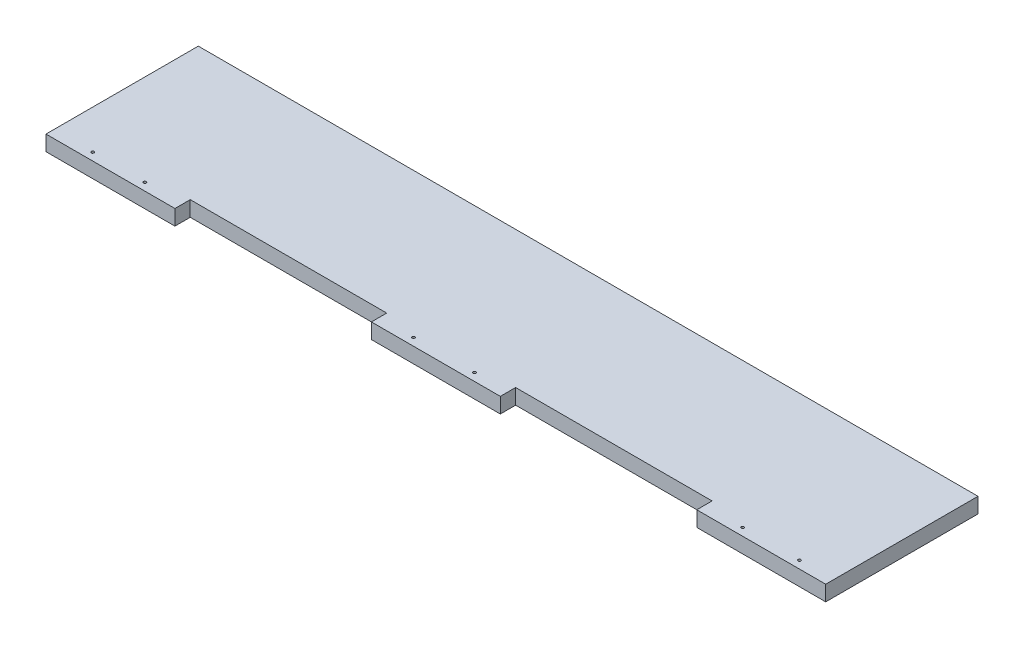
ISO-10303-21;
HEADER;
FILE_DESCRIPTION(('STEP AP214'),'2;1');
FILE_NAME('part.step','',(''),(''),'','','');
FILE_SCHEMA(('AUTOMOTIVE_DESIGN { 1 0 10303 214 1 1 1 1 }'));
ENDSEC;
DATA;
#1=APPLICATION_CONTEXT('core data for automotive mechanical design processes');
#2=APPLICATION_PROTOCOL_DEFINITION('international standard','automotive_design',2000,#1);
#3=PRODUCT_CONTEXT('',#1,'mechanical');
#4=PRODUCT('Part','Part','',(#3));
#5=PRODUCT_RELATED_PRODUCT_CATEGORY('part','',(#4));
#6=PRODUCT_DEFINITION_FORMATION('','',#4);
#7=PRODUCT_DEFINITION_CONTEXT('part definition',#1,'design');
#8=PRODUCT_DEFINITION('design','',#6,#7);
#9=PRODUCT_DEFINITION_SHAPE('','',#8);
#10=(LENGTH_UNIT() NAMED_UNIT(*) SI_UNIT(.MILLI.,.METRE.));
#11=(NAMED_UNIT(*) PLANE_ANGLE_UNIT() SI_UNIT($,.RADIAN.));
#12=(NAMED_UNIT(*) SI_UNIT($,.STERADIAN.) SOLID_ANGLE_UNIT());
#13=UNCERTAINTY_MEASURE_WITH_UNIT(LENGTH_MEASURE(1.E-05),#10,'distance_accuracy_value','');
#14=(GEOMETRIC_REPRESENTATION_CONTEXT(3) GLOBAL_UNCERTAINTY_ASSIGNED_CONTEXT((#13)) GLOBAL_UNIT_ASSIGNED_CONTEXT((#10,
#11,#12)) REPRESENTATION_CONTEXT('',''));
#15=CARTESIAN_POINT('',(0.,0.,0.));
#16=DIRECTION('',(0.,0.,1.));
#17=DIRECTION('',(1.,0.,0.));
#18=AXIS2_PLACEMENT_3D('',#15,#16,#17);
#19=CARTESIAN_POINT('',(-929.418408841076,3217.29154429096,189.));
#20=DIRECTION('',(0.,-1.,0.));
#21=DIRECTION('',(0.,0.,-1.));
#22=AXIS2_PLACEMENT_3D('',#19,#20,#21);
#23=PLANE('',#22);
#24=CARTESIAN_POINT('',(-971.446220261641,3217.29154429096,198.5));
#25=DIRECTION('',(0.,1.,0.));
#26=DIRECTION('',(0.,0.,1.));
#27=AXIS2_PLACEMENT_3D('',#24,#25,#26);
#28=CIRCLE('',#27,1.70000000000003);
#29=CARTESIAN_POINT('',(-971.446220261641,3217.29154429096,200.2));
#30=VERTEX_POINT('',#29);
#31=EDGE_CURVE('E286',#30,#30,#28,.T.);
#32=ORIENTED_EDGE('',*,*,#31,.F.);
#33=EDGE_LOOP('',(#32));
#34=FACE_BOUND('',#33,.T.);
#35=CARTESIAN_POINT('',(-1041.97724555431,3217.29154429096,198.5));
#36=DIRECTION('',(0.,1.,0.));
#37=DIRECTION('',(0.,0.,1.));
#38=AXIS2_PLACEMENT_3D('',#35,#36,#37);
#39=CIRCLE('',#38,1.70000000000003);
#40=CARTESIAN_POINT('',(-1041.97724555431,3217.29154429096,200.2));
#41=VERTEX_POINT('',#40);
#42=EDGE_CURVE('E280',#41,#41,#39,.T.);
#43=ORIENTED_EDGE('',*,*,#42,.F.);
#44=EDGE_LOOP('',(#43));
#45=FACE_BOUND('',#44,.T.);
#46=CARTESIAN_POINT('',(-1374.86191229691,3217.29154429096,198.5));
#47=DIRECTION('',(0.,1.,0.));
#48=DIRECTION('',(0.,0.,1.));
#49=AXIS2_PLACEMENT_3D('',#46,#47,#48);
#50=CIRCLE('',#49,1.70000000000003);
#51=CARTESIAN_POINT('',(-1374.86191229691,3217.29154429096,200.2));
#52=VERTEX_POINT('',#51);
#53=EDGE_CURVE('E274',#52,#52,#50,.T.);
#54=ORIENTED_EDGE('',*,*,#53,.F.);
#55=EDGE_LOOP('',(#54));
#56=FACE_BOUND('',#55,.T.);
#57=CARTESIAN_POINT('',(-1450.47578184059,3217.29154429096,198.5));
#58=DIRECTION('',(0.,1.,0.));
#59=DIRECTION('',(0.,0.,1.));
#60=AXIS2_PLACEMENT_3D('',#57,#58,#59);
#61=CIRCLE('',#60,1.70000000000003);
#62=CARTESIAN_POINT('',(-1450.47578184059,3217.29154429096,200.2));
#63=VERTEX_POINT('',#62);
#64=EDGE_CURVE('E268',#63,#63,#61,.T.);
#65=ORIENTED_EDGE('',*,*,#64,.F.);
#66=EDGE_LOOP('',(#65));
#67=FACE_BOUND('',#66,.T.);
#68=CARTESIAN_POINT('',(-1783.80265985826,3217.29154429096,198.5));
#69=DIRECTION('',(0.,1.,0.));
#70=DIRECTION('',(0.,0.,1.));
#71=AXIS2_PLACEMENT_3D('',#68,#69,#70);
#72=CIRCLE('',#71,1.70000000000003);
#73=CARTESIAN_POINT('',(-1783.80265985826,3217.29154429096,200.2));
#74=VERTEX_POINT('',#73);
#75=EDGE_CURVE('E262',#74,#74,#72,.T.);
#76=ORIENTED_EDGE('',*,*,#75,.F.);
#77=EDGE_LOOP('',(#76));
#78=FACE_BOUND('',#77,.T.);
#79=DIRECTION('',(-1.,0.,0.));
#80=VECTOR('',#79,1.);
#81=CARTESIAN_POINT('',(-929.418408841076,3217.29154429096,19.));
#82=LINE('',#81,#80);
#83=CARTESIAN_POINT('',(-929.418408841076,3217.29154429096,19.));
#84=VERTEX_POINT('',#83);
#85=CARTESIAN_POINT('',(-1897.01840884108,3217.29154429096,19.));
#86=VERTEX_POINT('',#85);
#87=EDGE_CURVE('E230',#84,#86,#82,.T.);
#88=ORIENTED_EDGE('',*,*,#87,.T.);
#89=DIRECTION('',(0.,0.,-1.));
#90=VECTOR('',#89,1.);
#91=CARTESIAN_POINT('',(-1897.01840884108,3217.29154429096,189.));
#92=LINE('',#91,#90);
#93=CARTESIAN_POINT('',(-1897.01840884108,3217.29154429096,208.));
#94=VERTEX_POINT('',#93);
#95=EDGE_CURVE('E41',#94,#86,#92,.T.);
#96=ORIENTED_EDGE('',*,*,#95,.F.);
#97=DIRECTION('',(1.,0.,0.));
#98=VECTOR('',#97,1.);
#99=CARTESIAN_POINT('',(-1737.01840884108,3217.29154429096,208.));
#100=LINE('',#99,#98);
#101=CARTESIAN_POINT('',(-1737.01840884108,3217.29154429096,208.));
#102=VERTEX_POINT('',#101);
#103=EDGE_CURVE('E203',#94,#102,#100,.T.);
#104=ORIENTED_EDGE('',*,*,#103,.T.);
#105=DIRECTION('',(0.,0.,-1.));
#106=VECTOR('',#105,1.);
#107=CARTESIAN_POINT('',(-1737.01840884108,3217.29154429096,227.));
#108=LINE('',#107,#106);
#109=CARTESIAN_POINT('',(-1737.01840884108,3217.29154429096,189.));
#110=VERTEX_POINT('',#109);
#111=EDGE_CURVE('E214',#102,#110,#108,.T.);
#112=ORIENTED_EDGE('',*,*,#111,.T.);
#113=DIRECTION('',(-1.,0.,0.));
#114=VECTOR('',#113,1.);
#115=CARTESIAN_POINT('',(-929.418408841076,3217.29154429096,189.));
#116=LINE('',#115,#114);
#117=CARTESIAN_POINT('',(-1493.21840884108,3217.29154429096,189.));
#118=VERTEX_POINT('',#117);
#119=EDGE_CURVE('E225',#118,#110,#116,.T.);
#120=ORIENTED_EDGE('',*,*,#119,.F.);
#121=DIRECTION('',(0.,0.,-1.));
#122=VECTOR('',#121,1.);
#123=CARTESIAN_POINT('',(-1493.21840884108,3217.29154429096,227.));
#124=LINE('',#123,#122);
#125=CARTESIAN_POINT('',(-1493.21840884108,3217.29154429096,208.));
#126=VERTEX_POINT('',#125);
#127=EDGE_CURVE('E183',#126,#118,#124,.T.);
#128=ORIENTED_EDGE('',*,*,#127,.F.);
#129=DIRECTION('',(1.,0.,0.));
#130=VECTOR('',#129,1.);
#131=CARTESIAN_POINT('',(-1333.21840884108,3217.29154429096,208.));
#132=LINE('',#131,#130);
#133=CARTESIAN_POINT('',(-1333.21840884108,3217.29154429096,208.));
#134=VERTEX_POINT('',#133);
#135=EDGE_CURVE('E167',#126,#134,#132,.T.);
#136=ORIENTED_EDGE('',*,*,#135,.T.);
#137=DIRECTION('',(0.,0.,-1.));
#138=VECTOR('',#137,1.);
#139=CARTESIAN_POINT('',(-1333.21840884108,3217.29154429096,227.));
#140=LINE('',#139,#138);
#141=CARTESIAN_POINT('',(-1333.21840884108,3217.29154429096,189.));
#142=VERTEX_POINT('',#141);
#143=EDGE_CURVE('E189',#134,#142,#140,.T.);
#144=ORIENTED_EDGE('',*,*,#143,.T.);
#145=CARTESIAN_POINT('',(-1089.41840884108,3217.29154429096,189.));
#146=VERTEX_POINT('',#145);
#147=EDGE_CURVE('E129',#146,#142,#116,.T.);
#148=ORIENTED_EDGE('',*,*,#147,.F.);
#149=DIRECTION('',(0.,0.,-1.));
#150=VECTOR('',#149,1.);
#151=CARTESIAN_POINT('',(-1089.41840884108,3217.29154429096,227.));
#152=LINE('',#151,#150);
#153=CARTESIAN_POINT('',(-1089.41840884108,3217.29154429096,208.));
#154=VERTEX_POINT('',#153);
#155=EDGE_CURVE('E140',#154,#146,#152,.T.);
#156=ORIENTED_EDGE('',*,*,#155,.F.);
#157=DIRECTION('',(1.,0.,0.));
#158=VECTOR('',#157,1.);
#159=CARTESIAN_POINT('',(-929.418408841076,3217.29154429096,208.));
#160=LINE('',#159,#158);
#161=CARTESIAN_POINT('',(-929.418408841076,3217.29154429096,208.));
#162=VERTEX_POINT('',#161);
#163=EDGE_CURVE('E139',#154,#162,#160,.T.);
#164=ORIENTED_EDGE('',*,*,#163,.T.);
#165=DIRECTION('',(0.,0.,-1.));
#166=VECTOR('',#165,1.);
#167=CARTESIAN_POINT('',(-929.418408841076,3217.29154429096,189.));
#168=LINE('',#167,#166);
#169=EDGE_CURVE('E11',#162,#84,#168,.T.);
#170=ORIENTED_EDGE('',*,*,#169,.T.);
#171=EDGE_LOOP('',(#88,#96,#104,#112,#120,#128,#136,#144,#148,#156,#164,#170));
#172=FACE_BOUND('',#171,.T.);
#173=CARTESIAN_POINT('',(-1848.5457505431,3217.29154429096,198.5));
#174=DIRECTION('',(0.,1.,0.));
#175=DIRECTION('',(0.,0.,1.));
#176=AXIS2_PLACEMENT_3D('',#173,#174,#175);
#177=CIRCLE('',#176,1.70000000000003);
#178=CARTESIAN_POINT('',(-1848.5457505431,3217.29154429096,200.2));
#179=VERTEX_POINT('',#178);
#180=EDGE_CURVE('E149',#179,#179,#177,.T.);
#181=ORIENTED_EDGE('',*,*,#180,.F.);
#182=EDGE_LOOP('',(#181));
#183=FACE_BOUND('',#182,.T.);
#184=ADVANCED_FACE('F33',(#34,#45,#56,#67,#78,#172,#183),#23,.F.);
#185=CARTESIAN_POINT('',(0.,0.,189.));
#186=DIRECTION('',(0.,0.,-1.));
#187=DIRECTION('',(-1.,0.,0.));
#188=AXIS2_PLACEMENT_3D('',#185,#186,#187);
#189=PLANE('',#188);
#190=CARTESIAN_POINT('',(-1089.41840884108,3217.29154429096,189.));
#191=CARTESIAN_POINT('',(-1089.41840884108,3198.29154429096,189.));
#192=B_SPLINE_CURVE_WITH_KNOTS('',1,(#190,#191),.UNSPECIFIED.,.F.,.F.,(2,2),(0.,
0.0530726256983244),.UNSPECIFIED.);
#193=CARTESIAN_POINT('',(-1089.41840884108,3198.29154429096,189.));
#194=VERTEX_POINT('',#193);
#195=EDGE_CURVE('E48',#146,#194,#192,.T.);
#196=ORIENTED_EDGE('',*,*,#195,.F.);
#197=ORIENTED_EDGE('',*,*,#147,.T.);
#198=CARTESIAN_POINT('',(-1333.21840884108,3198.29154429096,189.));
#199=CARTESIAN_POINT('',(-1333.21840884108,3217.29154429096,189.));
#200=B_SPLINE_CURVE_WITH_KNOTS('',1,(#198,#199),.UNSPECIFIED.,.F.,.F.,(2,2),(0.5,
0.553072625698324),.UNSPECIFIED.);
#201=CARTESIAN_POINT('',(-1333.21840884108,3198.29154429096,189.));
#202=VERTEX_POINT('',#201);
#203=EDGE_CURVE('E124',#202,#142,#200,.T.);
#204=ORIENTED_EDGE('',*,*,#203,.F.);
#205=DIRECTION('',(1.,0.,0.));
#206=VECTOR('',#205,1.);
#207=CARTESIAN_POINT('',(-929.418408841076,3198.29154429096,189.));
#208=LINE('',#207,#206);
#209=EDGE_CURVE('E120',#202,#194,#208,.T.);
#210=ORIENTED_EDGE('',*,*,#209,.T.);
#211=EDGE_LOOP('',(#196,#197,#204,#210));
#212=FACE_BOUND('',#211,.T.);
#213=ADVANCED_FACE('F122',(#212),#189,.F.);
#214=CARTESIAN_POINT('',(-1493.21840884108,3217.29154429096,189.));
#215=CARTESIAN_POINT('',(-1493.21840884108,3198.29154429096,189.));
#216=B_SPLINE_CURVE_WITH_KNOTS('',1,(#214,#215),.UNSPECIFIED.,.F.,.F.,(2,2),(0.,
0.0530726256983244),.UNSPECIFIED.);
#217=CARTESIAN_POINT('',(-1493.21840884108,3198.29154429096,189.));
#218=VERTEX_POINT('',#217);
#219=EDGE_CURVE('E56',#118,#218,#216,.T.);
#220=ORIENTED_EDGE('',*,*,#219,.F.);
#221=ORIENTED_EDGE('',*,*,#119,.T.);
#222=CARTESIAN_POINT('',(-1737.01840884108,3198.29154429096,189.));
#223=CARTESIAN_POINT('',(-1737.01840884108,3217.29154429096,189.));
#224=B_SPLINE_CURVE_WITH_KNOTS('',1,(#222,#223),.UNSPECIFIED.,.F.,.F.,(2,2),(0.5,
0.553072625698324),.UNSPECIFIED.);
#225=CARTESIAN_POINT('',(-1737.01840884108,3198.29154429096,189.));
#226=VERTEX_POINT('',#225);
#227=EDGE_CURVE('E173',#226,#110,#224,.T.);
#228=ORIENTED_EDGE('',*,*,#227,.F.);
#229=EDGE_CURVE('E128',#226,#218,#208,.T.);
#230=ORIENTED_EDGE('',*,*,#229,.T.);
#231=EDGE_LOOP('',(#220,#221,#228,#230));
#232=FACE_BOUND('',#231,.T.);
#233=ADVANCED_FACE('F343',(#232),#189,.F.);
#234=CARTESIAN_POINT('',(-929.418408841076,3217.29154429096,189.));
#235=DIRECTION('',(-1.,0.,0.));
#236=DIRECTION('',(0.,0.,1.));
#237=AXIS2_PLACEMENT_3D('',#234,#235,#236);
#238=PLANE('',#237);
#239=DIRECTION('',(0.,1.,0.));
#240=VECTOR('',#239,1.);
#241=CARTESIAN_POINT('',(-929.418408841076,3217.29154429096,19.));
#242=LINE('',#241,#240);
#243=CARTESIAN_POINT('',(-929.418408841076,3198.29154429096,19.));
#244=VERTEX_POINT('',#243);
#245=EDGE_CURVE('E209',#244,#84,#242,.T.);
#246=ORIENTED_EDGE('',*,*,#245,.T.);
#247=ORIENTED_EDGE('',*,*,#169,.F.);
#248=DIRECTION('',(0.,-1.,0.));
#249=VECTOR('',#248,1.);
#250=CARTESIAN_POINT('',(-929.418408841076,3198.29154429096,208.));
#251=LINE('',#250,#249);
#252=CARTESIAN_POINT('',(-929.418408841076,3198.29154429096,208.));
#253=VERTEX_POINT('',#252);
#254=EDGE_CURVE('E162',#162,#253,#251,.T.);
#255=ORIENTED_EDGE('',*,*,#254,.T.);
#256=DIRECTION('',(0.,0.,-1.));
#257=VECTOR('',#256,1.);
#258=CARTESIAN_POINT('',(-929.418408841076,3198.29154429096,189.));
#259=LINE('',#258,#257);
#260=EDGE_CURVE('E227',#253,#244,#259,.T.);
#261=ORIENTED_EDGE('',*,*,#260,.T.);
#262=EDGE_LOOP('',(#246,#247,#255,#261));
#263=FACE_BOUND('',#262,.T.);
#264=ADVANCED_FACE('F35',(#263),#238,.F.);
#265=CARTESIAN_POINT('',(-1897.01840884108,3217.29154429096,189.));
#266=DIRECTION('',(1.,0.,0.));
#267=DIRECTION('',(0.,0.,-1.));
#268=AXIS2_PLACEMENT_3D('',#265,#266,#267);
#269=PLANE('',#268);
#270=DIRECTION('',(0.,-1.,0.));
#271=VECTOR('',#270,1.);
#272=CARTESIAN_POINT('',(-1897.01840884108,3217.29154429096,19.));
#273=LINE('',#272,#271);
#274=CARTESIAN_POINT('',(-1897.01840884108,3198.29154429096,19.));
#275=VERTEX_POINT('',#274);
#276=EDGE_CURVE('E232',#86,#275,#273,.T.);
#277=ORIENTED_EDGE('',*,*,#276,.T.);
#278=DIRECTION('',(0.,0.,-1.));
#279=VECTOR('',#278,1.);
#280=CARTESIAN_POINT('',(-1897.01840884108,3198.29154429096,189.));
#281=LINE('',#280,#279);
#282=CARTESIAN_POINT('',(-1897.01840884108,3198.29154429096,208.));
#283=VERTEX_POINT('',#282);
#284=EDGE_CURVE('E238',#283,#275,#281,.T.);
#285=ORIENTED_EDGE('',*,*,#284,.F.);
#286=DIRECTION('',(0.,1.,0.));
#287=VECTOR('',#286,1.);
#288=CARTESIAN_POINT('',(-1897.01840884108,3217.29154429096,208.));
#289=LINE('',#288,#287);
#290=EDGE_CURVE('E206',#283,#94,#289,.T.);
#291=ORIENTED_EDGE('',*,*,#290,.T.);
#292=ORIENTED_EDGE('',*,*,#95,.T.);
#293=EDGE_LOOP('',(#277,#285,#291,#292));
#294=FACE_BOUND('',#293,.T.);
#295=ADVANCED_FACE('F243',(#294),#269,.F.);
#296=CARTESIAN_POINT('',(-929.418408841076,3198.29154429096,189.));
#297=DIRECTION('',(0.,1.,0.));
#298=DIRECTION('',(0.,0.,1.));
#299=AXIS2_PLACEMENT_3D('',#296,#297,#298);
#300=PLANE('',#299);
#301=CARTESIAN_POINT('',(-971.446220261641,3198.29154429096,198.5));
#302=DIRECTION('',(0.,1.,0.));
#303=DIRECTION('',(0.,0.,1.));
#304=AXIS2_PLACEMENT_3D('',#301,#302,#303);
#305=CIRCLE('',#304,1.70000000000003);
#306=CARTESIAN_POINT('',(-971.446220261641,3198.29154429096,200.2));
#307=VERTEX_POINT('',#306);
#308=EDGE_CURVE('E283',#307,#307,#305,.T.);
#309=ORIENTED_EDGE('',*,*,#308,.T.);
#310=EDGE_LOOP('',(#309));
#311=FACE_BOUND('',#310,.T.);
#312=CARTESIAN_POINT('',(-1041.97724555431,3198.29154429096,198.5));
#313=DIRECTION('',(0.,1.,0.));
#314=DIRECTION('',(0.,0.,1.));
#315=AXIS2_PLACEMENT_3D('',#312,#313,#314);
#316=CIRCLE('',#315,1.70000000000003);
#317=CARTESIAN_POINT('',(-1041.97724555431,3198.29154429096,200.2));
#318=VERTEX_POINT('',#317);
#319=EDGE_CURVE('E277',#318,#318,#316,.T.);
#320=ORIENTED_EDGE('',*,*,#319,.T.);
#321=EDGE_LOOP('',(#320));
#322=FACE_BOUND('',#321,.T.);
#323=CARTESIAN_POINT('',(-1374.86191229691,3198.29154429096,198.5));
#324=DIRECTION('',(0.,1.,0.));
#325=DIRECTION('',(0.,0.,1.));
#326=AXIS2_PLACEMENT_3D('',#323,#324,#325);
#327=CIRCLE('',#326,1.70000000000003);
#328=CARTESIAN_POINT('',(-1374.86191229691,3198.29154429096,200.2));
#329=VERTEX_POINT('',#328);
#330=EDGE_CURVE('E271',#329,#329,#327,.T.);
#331=ORIENTED_EDGE('',*,*,#330,.T.);
#332=EDGE_LOOP('',(#331));
#333=FACE_BOUND('',#332,.T.);
#334=CARTESIAN_POINT('',(-1450.47578184059,3198.29154429096,198.5));
#335=DIRECTION('',(0.,1.,0.));
#336=DIRECTION('',(0.,0.,1.));
#337=AXIS2_PLACEMENT_3D('',#334,#335,#336);
#338=CIRCLE('',#337,1.70000000000003);
#339=CARTESIAN_POINT('',(-1450.47578184059,3198.29154429096,200.2));
#340=VERTEX_POINT('',#339);
#341=EDGE_CURVE('E265',#340,#340,#338,.T.);
#342=ORIENTED_EDGE('',*,*,#341,.T.);
#343=EDGE_LOOP('',(#342));
#344=FACE_BOUND('',#343,.T.);
#345=CARTESIAN_POINT('',(-1783.80265985826,3198.29154429096,198.5));
#346=DIRECTION('',(0.,1.,0.));
#347=DIRECTION('',(0.,0.,1.));
#348=AXIS2_PLACEMENT_3D('',#345,#346,#347);
#349=CIRCLE('',#348,1.70000000000003);
#350=CARTESIAN_POINT('',(-1783.80265985826,3198.29154429096,200.2));
#351=VERTEX_POINT('',#350);
#352=EDGE_CURVE('E259',#351,#351,#349,.T.);
#353=ORIENTED_EDGE('',*,*,#352,.T.);
#354=EDGE_LOOP('',(#353));
#355=FACE_BOUND('',#354,.T.);
#356=CARTESIAN_POINT('',(-1848.5457505431,3198.29154429096,198.5));
#357=DIRECTION('',(0.,1.,0.));
#358=DIRECTION('',(0.,0.,1.));
#359=AXIS2_PLACEMENT_3D('',#356,#357,#358);
#360=CIRCLE('',#359,1.70000000000003);
#361=CARTESIAN_POINT('',(-1848.5457505431,3198.29154429096,200.2));
#362=VERTEX_POINT('',#361);
#363=EDGE_CURVE('E145',#362,#362,#360,.T.);
#364=ORIENTED_EDGE('',*,*,#363,.T.);
#365=EDGE_LOOP('',(#364));
#366=FACE_BOUND('',#365,.T.);
#367=DIRECTION('',(1.,0.,0.));
#368=VECTOR('',#367,1.);
#369=CARTESIAN_POINT('',(-929.418408841076,3198.29154429096,19.));
#370=LINE('',#369,#368);
#371=EDGE_CURVE('E234',#275,#244,#370,.T.);
#372=ORIENTED_EDGE('',*,*,#371,.T.);
#373=ORIENTED_EDGE('',*,*,#260,.F.);
#374=DIRECTION('',(-1.,0.,0.));
#375=VECTOR('',#374,1.);
#376=CARTESIAN_POINT('',(-1089.41840884108,3198.29154429096,208.));
#377=LINE('',#376,#375);
#378=CARTESIAN_POINT('',(-1089.41840884108,3198.29154429096,208.));
#379=VERTEX_POINT('',#378);
#380=EDGE_CURVE('E136',#253,#379,#377,.T.);
#381=ORIENTED_EDGE('',*,*,#380,.T.);
#382=DIRECTION('',(0.,0.,-1.));
#383=VECTOR('',#382,1.);
#384=CARTESIAN_POINT('',(-1089.41840884108,3198.29154429096,227.));
#385=LINE('',#384,#383);
#386=EDGE_CURVE('E133',#379,#194,#385,.T.);
#387=ORIENTED_EDGE('',*,*,#386,.T.);
#388=ORIENTED_EDGE('',*,*,#209,.F.);
#389=DIRECTION('',(0.,0.,-1.));
#390=VECTOR('',#389,1.);
#391=CARTESIAN_POINT('',(-1333.21840884108,3198.29154429096,227.));
#392=LINE('',#391,#390);
#393=CARTESIAN_POINT('',(-1333.21840884108,3198.29154429096,208.));
#394=VERTEX_POINT('',#393);
#395=EDGE_CURVE('E192',#394,#202,#392,.T.);
#396=ORIENTED_EDGE('',*,*,#395,.F.);
#397=DIRECTION('',(-1.,0.,0.));
#398=VECTOR('',#397,1.);
#399=CARTESIAN_POINT('',(-1493.21840884108,3198.29154429096,208.));
#400=LINE('',#399,#398);
#401=CARTESIAN_POINT('',(-1493.21840884108,3198.29154429096,208.));
#402=VERTEX_POINT('',#401);
#403=EDGE_CURVE('E166',#394,#402,#400,.T.);
#404=ORIENTED_EDGE('',*,*,#403,.T.);
#405=DIRECTION('',(0.,0.,-1.));
#406=VECTOR('',#405,1.);
#407=CARTESIAN_POINT('',(-1493.21840884108,3198.29154429096,227.));
#408=LINE('',#407,#406);
#409=EDGE_CURVE('E194',#402,#218,#408,.T.);
#410=ORIENTED_EDGE('',*,*,#409,.T.);
#411=ORIENTED_EDGE('',*,*,#229,.F.);
#412=DIRECTION('',(0.,0.,-1.));
#413=VECTOR('',#412,1.);
#414=CARTESIAN_POINT('',(-1737.01840884108,3198.29154429096,227.));
#415=LINE('',#414,#413);
#416=CARTESIAN_POINT('',(-1737.01840884108,3198.29154429096,208.));
#417=VERTEX_POINT('',#416);
#418=EDGE_CURVE('E220',#417,#226,#415,.T.);
#419=ORIENTED_EDGE('',*,*,#418,.F.);
#420=DIRECTION('',(-1.,0.,0.));
#421=VECTOR('',#420,1.);
#422=CARTESIAN_POINT('',(-1897.01840884108,3198.29154429096,208.));
#423=LINE('',#422,#421);
#424=EDGE_CURVE('E202',#417,#283,#423,.T.);
#425=ORIENTED_EDGE('',*,*,#424,.T.);
#426=ORIENTED_EDGE('',*,*,#284,.T.);
#427=EDGE_LOOP('',(#372,#373,#381,#387,#388,#396,#404,#410,#411,#419,#425,#426));
#428=FACE_BOUND('',#427,.T.);
#429=ADVANCED_FACE('F134',(#311,#322,#333,#344,#355,#366,#428),#300,.F.);
#430=CARTESIAN_POINT('',(0.,0.,19.));
#431=DIRECTION('',(0.,0.,-1.));
#432=DIRECTION('',(-1.,0.,0.));
#433=AXIS2_PLACEMENT_3D('',#430,#431,#432);
#434=PLANE('',#433);
#435=ORIENTED_EDGE('',*,*,#245,.F.);
#436=ORIENTED_EDGE('',*,*,#371,.F.);
#437=ORIENTED_EDGE('',*,*,#276,.F.);
#438=ORIENTED_EDGE('',*,*,#87,.F.);
#439=EDGE_LOOP('',(#435,#436,#437,#438));
#440=FACE_BOUND('',#439,.T.);
#441=ADVANCED_FACE('F250',(#440),#434,.T.);
#442=CARTESIAN_POINT('',(-1737.01840884108,3198.29154429096,227.));
#443=DIRECTION('',(-1.,0.,0.));
#444=DIRECTION('',(0.,0.,1.));
#445=AXIS2_PLACEMENT_3D('',#442,#443,#444);
#446=PLANE('',#445);
#447=ORIENTED_EDGE('',*,*,#111,.F.);
#448=DIRECTION('',(0.,-1.,0.));
#449=VECTOR('',#448,1.);
#450=CARTESIAN_POINT('',(-1737.01840884108,3198.29154429096,208.));
#451=LINE('',#450,#449);
#452=EDGE_CURVE('E199',#102,#417,#451,.T.);
#453=ORIENTED_EDGE('',*,*,#452,.T.);
#454=ORIENTED_EDGE('',*,*,#418,.T.);
#455=ORIENTED_EDGE('',*,*,#227,.T.);
#456=EDGE_LOOP('',(#447,#453,#454,#455));
#457=FACE_BOUND('',#456,.T.);
#458=ADVANCED_FACE('F338',(#457),#446,.F.);
#459=CARTESIAN_POINT('',(0.,0.,208.));
#460=DIRECTION('',(0.,0.,-1.));
#461=DIRECTION('',(-1.,0.,0.));
#462=AXIS2_PLACEMENT_3D('',#459,#460,#461);
#463=PLANE('',#462);
#464=ORIENTED_EDGE('',*,*,#424,.F.);
#465=ORIENTED_EDGE('',*,*,#452,.F.);
#466=ORIENTED_EDGE('',*,*,#103,.F.);
#467=ORIENTED_EDGE('',*,*,#290,.F.);
#468=EDGE_LOOP('',(#464,#465,#466,#467));
#469=FACE_BOUND('',#468,.T.);
#470=ADVANCED_FACE('F331',(#469),#463,.F.);
#471=CARTESIAN_POINT('',(-1333.21840884108,3198.29154429096,227.));
#472=DIRECTION('',(-1.,0.,0.));
#473=DIRECTION('',(0.,0.,1.));
#474=AXIS2_PLACEMENT_3D('',#471,#472,#473);
#475=PLANE('',#474);
#476=ORIENTED_EDGE('',*,*,#143,.F.);
#477=DIRECTION('',(0.,-1.,0.));
#478=VECTOR('',#477,1.);
#479=CARTESIAN_POINT('',(-1333.21840884108,3198.29154429096,208.));
#480=LINE('',#479,#478);
#481=EDGE_CURVE('E163',#134,#394,#480,.T.);
#482=ORIENTED_EDGE('',*,*,#481,.T.);
#483=ORIENTED_EDGE('',*,*,#395,.T.);
#484=ORIENTED_EDGE('',*,*,#203,.T.);
#485=EDGE_LOOP('',(#476,#482,#483,#484));
#486=FACE_BOUND('',#485,.T.);
#487=ADVANCED_FACE('F328',(#486),#475,.F.);
#488=CARTESIAN_POINT('',(-1493.21840884108,3217.29154429096,227.));
#489=DIRECTION('',(1.,0.,0.));
#490=DIRECTION('',(0.,0.,-1.));
#491=AXIS2_PLACEMENT_3D('',#488,#489,#490);
#492=PLANE('',#491);
#493=ORIENTED_EDGE('',*,*,#409,.F.);
#494=DIRECTION('',(0.,1.,0.));
#495=VECTOR('',#494,1.);
#496=CARTESIAN_POINT('',(-1493.21840884108,3217.29154429096,208.));
#497=LINE('',#496,#495);
#498=EDGE_CURVE('E170',#402,#126,#497,.T.);
#499=ORIENTED_EDGE('',*,*,#498,.T.);
#500=ORIENTED_EDGE('',*,*,#127,.T.);
#501=ORIENTED_EDGE('',*,*,#219,.T.);
#502=EDGE_LOOP('',(#493,#499,#500,#501));
#503=FACE_BOUND('',#502,.T.);
#504=ADVANCED_FACE('F326',(#503),#492,.F.);
#505=CARTESIAN_POINT('',(0.,0.,208.));
#506=DIRECTION('',(0.,0.,-1.));
#507=DIRECTION('',(-1.,0.,0.));
#508=AXIS2_PLACEMENT_3D('',#505,#506,#507);
#509=PLANE('',#508);
#510=ORIENTED_EDGE('',*,*,#403,.F.);
#511=ORIENTED_EDGE('',*,*,#481,.F.);
#512=ORIENTED_EDGE('',*,*,#135,.F.);
#513=ORIENTED_EDGE('',*,*,#498,.F.);
#514=EDGE_LOOP('',(#510,#511,#512,#513));
#515=FACE_BOUND('',#514,.T.);
#516=ADVANCED_FACE('F323',(#515),#509,.F.);
#517=CARTESIAN_POINT('',(-1089.41840884108,3217.29154429096,227.));
#518=DIRECTION('',(1.,0.,0.));
#519=DIRECTION('',(0.,0.,-1.));
#520=AXIS2_PLACEMENT_3D('',#517,#518,#519);
#521=PLANE('',#520);
#522=ORIENTED_EDGE('',*,*,#386,.F.);
#523=DIRECTION('',(0.,1.,0.));
#524=VECTOR('',#523,1.);
#525=CARTESIAN_POINT('',(-1089.41840884108,3217.29154429096,208.));
#526=LINE('',#525,#524);
#527=EDGE_CURVE('E154',#379,#154,#526,.T.);
#528=ORIENTED_EDGE('',*,*,#527,.T.);
#529=ORIENTED_EDGE('',*,*,#155,.T.);
#530=ORIENTED_EDGE('',*,*,#195,.T.);
#531=EDGE_LOOP('',(#522,#528,#529,#530));
#532=FACE_BOUND('',#531,.T.);
#533=ADVANCED_FACE('F143',(#532),#521,.F.);
#534=CARTESIAN_POINT('',(0.,0.,208.));
#535=DIRECTION('',(0.,0.,-1.));
#536=DIRECTION('',(-1.,0.,0.));
#537=AXIS2_PLACEMENT_3D('',#534,#535,#536);
#538=PLANE('',#537);
#539=ORIENTED_EDGE('',*,*,#380,.F.);
#540=ORIENTED_EDGE('',*,*,#254,.F.);
#541=ORIENTED_EDGE('',*,*,#163,.F.);
#542=ORIENTED_EDGE('',*,*,#527,.F.);
#543=EDGE_LOOP('',(#539,#540,#541,#542));
#544=FACE_BOUND('',#543,.T.);
#545=ADVANCED_FACE('F307',(#544),#538,.F.);
#546=CARTESIAN_POINT('',(-1848.5457505431,3217.29154429096,198.5));
#547=DIRECTION('',(0.,1.,0.));
#548=DIRECTION('',(0.,0.,1.));
#549=AXIS2_PLACEMENT_3D('',#546,#547,#548);
#550=CYLINDRICAL_SURFACE('',#549,1.70000000000003);
#551=ORIENTED_EDGE('',*,*,#363,.F.);
#552=EDGE_LOOP('',(#551));
#553=FACE_BOUND('',#552,.T.);
#554=ORIENTED_EDGE('',*,*,#180,.T.);
#555=EDGE_LOOP('',(#554));
#556=FACE_BOUND('',#555,.T.);
#557=ADVANCED_FACE('F304',(#553,#556),#550,.F.);
#558=CARTESIAN_POINT('',(-1783.80265985826,3217.29154429096,198.5));
#559=DIRECTION('',(0.,1.,0.));
#560=DIRECTION('',(0.,0.,1.));
#561=AXIS2_PLACEMENT_3D('',#558,#559,#560);
#562=CYLINDRICAL_SURFACE('',#561,1.70000000000003);
#563=ORIENTED_EDGE('',*,*,#352,.F.);
#564=EDGE_LOOP('',(#563));
#565=FACE_BOUND('',#564,.T.);
#566=ORIENTED_EDGE('',*,*,#75,.T.);
#567=EDGE_LOOP('',(#566));
#568=FACE_BOUND('',#567,.T.);
#569=ADVANCED_FACE('F306',(#565,#568),#562,.F.);
#570=CARTESIAN_POINT('',(-1450.47578184059,3217.29154429096,198.5));
#571=DIRECTION('',(0.,1.,0.));
#572=DIRECTION('',(0.,0.,1.));
#573=AXIS2_PLACEMENT_3D('',#570,#571,#572);
#574=CYLINDRICAL_SURFACE('',#573,1.70000000000003);
#575=ORIENTED_EDGE('',*,*,#341,.F.);
#576=EDGE_LOOP('',(#575));
#577=FACE_BOUND('',#576,.T.);
#578=ORIENTED_EDGE('',*,*,#64,.T.);
#579=EDGE_LOOP('',(#578));
#580=FACE_BOUND('',#579,.T.);
#581=ADVANCED_FACE('F314',(#577,#580),#574,.F.);
#582=CARTESIAN_POINT('',(-1374.86191229691,3217.29154429096,198.5));
#583=DIRECTION('',(0.,1.,0.));
#584=DIRECTION('',(0.,0.,1.));
#585=AXIS2_PLACEMENT_3D('',#582,#583,#584);
#586=CYLINDRICAL_SURFACE('',#585,1.70000000000003);
#587=ORIENTED_EDGE('',*,*,#330,.F.);
#588=EDGE_LOOP('',(#587));
#589=FACE_BOUND('',#588,.T.);
#590=ORIENTED_EDGE('',*,*,#53,.T.);
#591=EDGE_LOOP('',(#590));
#592=FACE_BOUND('',#591,.T.);
#593=ADVANCED_FACE('F406',(#589,#592),#586,.F.);
#594=CARTESIAN_POINT('',(-1041.97724555431,3217.29154429096,198.5));
#595=DIRECTION('',(0.,1.,0.));
#596=DIRECTION('',(0.,0.,1.));
#597=AXIS2_PLACEMENT_3D('',#594,#595,#596);
#598=CYLINDRICAL_SURFACE('',#597,1.70000000000003);
#599=ORIENTED_EDGE('',*,*,#319,.F.);
#600=EDGE_LOOP('',(#599));
#601=FACE_BOUND('',#600,.T.);
#602=ORIENTED_EDGE('',*,*,#42,.T.);
#603=EDGE_LOOP('',(#602));
#604=FACE_BOUND('',#603,.T.);
#605=ADVANCED_FACE('F415',(#601,#604),#598,.F.);
#606=CARTESIAN_POINT('',(-971.446220261641,3217.29154429096,198.5));
#607=DIRECTION('',(0.,1.,0.));
#608=DIRECTION('',(0.,0.,1.));
#609=AXIS2_PLACEMENT_3D('',#606,#607,#608);
#610=CYLINDRICAL_SURFACE('',#609,1.70000000000003);
#611=ORIENTED_EDGE('',*,*,#308,.F.);
#612=EDGE_LOOP('',(#611));
#613=FACE_BOUND('',#612,.T.);
#614=ORIENTED_EDGE('',*,*,#31,.T.);
#615=EDGE_LOOP('',(#614));
#616=FACE_BOUND('',#615,.T.);
#617=ADVANCED_FACE('F290',(#613,#616),#610,.F.);
#618=CLOSED_SHELL('',(#184,#213,#233,#264,#295,#429,#441,#458,#470,#487,#504,#516,#533,#545,
#557,#569,#581,#593,#605,#617));
#619=MANIFOLD_SOLID_BREP('B2',#618);
#620=ADVANCED_BREP_SHAPE_REPRESENTATION('',(#18,#619),#14);
#621=SHAPE_DEFINITION_REPRESENTATION(#9,#620);
ENDSEC;
END-ISO-10303-21;
